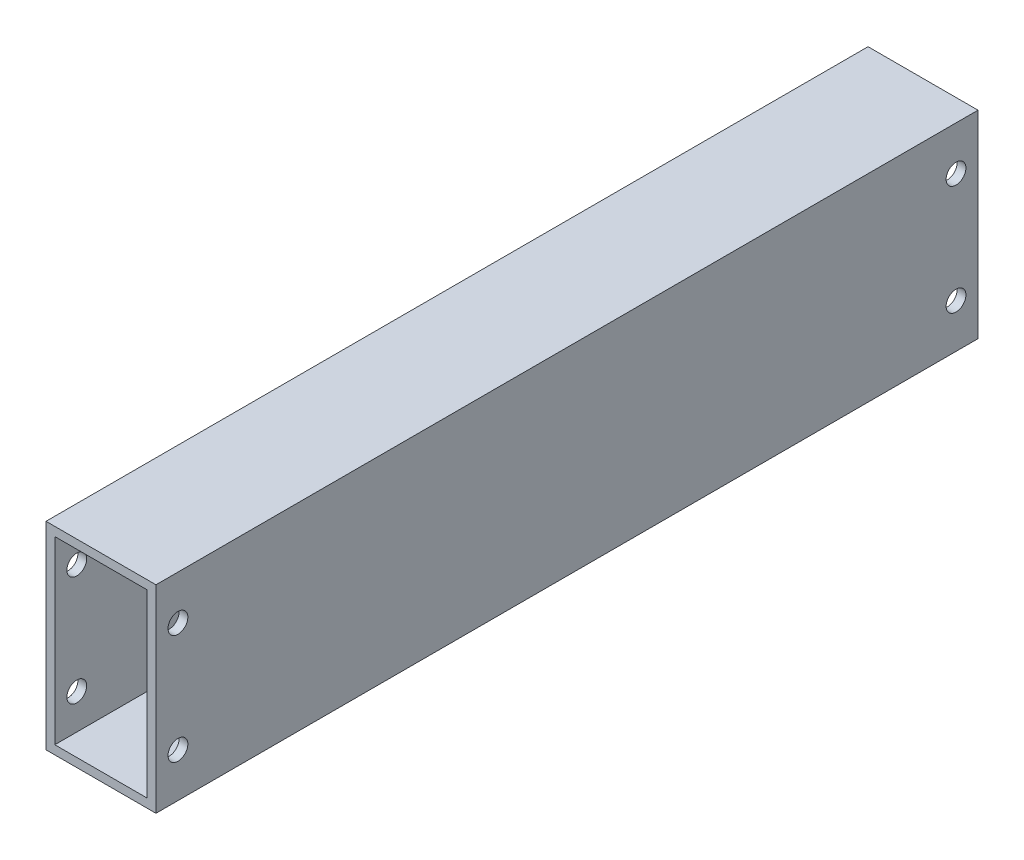
ISO-10303-21;
HEADER;
FILE_DESCRIPTION(('STEP AP214'),'2;1');
FILE_NAME('part.step','',(''),(''),'','','');
FILE_SCHEMA(('AUTOMOTIVE_DESIGN { 1 0 10303 214 1 1 1 1 }'));
ENDSEC;
DATA;
#1=APPLICATION_CONTEXT('core data for automotive mechanical design processes');
#2=APPLICATION_PROTOCOL_DEFINITION('international standard','automotive_design',2000,#1);
#3=PRODUCT_CONTEXT('',#1,'mechanical');
#4=PRODUCT('Part','Part','',(#3));
#5=PRODUCT_RELATED_PRODUCT_CATEGORY('part','',(#4));
#6=PRODUCT_DEFINITION_FORMATION('','',#4);
#7=PRODUCT_DEFINITION_CONTEXT('part definition',#1,'design');
#8=PRODUCT_DEFINITION('design','',#6,#7);
#9=PRODUCT_DEFINITION_SHAPE('','',#8);
#10=(LENGTH_UNIT() NAMED_UNIT(*) SI_UNIT(.MILLI.,.METRE.));
#11=(NAMED_UNIT(*) PLANE_ANGLE_UNIT() SI_UNIT($,.RADIAN.));
#12=(NAMED_UNIT(*) SI_UNIT($,.STERADIAN.) SOLID_ANGLE_UNIT());
#13=UNCERTAINTY_MEASURE_WITH_UNIT(LENGTH_MEASURE(1.E-05),#10,'distance_accuracy_value','');
#14=(GEOMETRIC_REPRESENTATION_CONTEXT(3) GLOBAL_UNCERTAINTY_ASSIGNED_CONTEXT((#13)) GLOBAL_UNIT_ASSIGNED_CONTEXT((#10,
#11,#12)) REPRESENTATION_CONTEXT('',''));
#15=CARTESIAN_POINT('',(0.,0.,0.));
#16=DIRECTION('',(0.,0.,1.));
#17=DIRECTION('',(1.,0.,0.));
#18=AXIS2_PLACEMENT_3D('',#15,#16,#17);
#19=CARTESIAN_POINT('',(0.,0.,226.9));
#20=DIRECTION('',(0.,0.,1.));
#21=DIRECTION('',(1.,0.,0.));
#22=AXIS2_PLACEMENT_3D('',#19,#20,#21);
#23=PLANE('',#22);
#24=DIRECTION('',(0.,-1.,0.));
#25=VECTOR('',#24,1.);
#26=CARTESIAN_POINT('',(-12.5,-22.5,226.9));
#27=LINE('',#26,#25);
#28=CARTESIAN_POINT('',(-12.5,22.5,226.9));
#29=VERTEX_POINT('',#28);
#30=CARTESIAN_POINT('',(-12.5,-22.5,226.9));
#31=VERTEX_POINT('',#30);
#32=EDGE_CURVE('E164',#29,#31,#27,.T.);
#33=ORIENTED_EDGE('',*,*,#32,.T.);
#34=DIRECTION('',(1.,0.,0.));
#35=VECTOR('',#34,1.);
#36=CARTESIAN_POINT('',(12.5,-22.5,226.9));
#37=LINE('',#36,#35);
#38=CARTESIAN_POINT('',(12.5,-22.5,226.9));
#39=VERTEX_POINT('',#38);
#40=EDGE_CURVE('E168',#31,#39,#37,.T.);
#41=ORIENTED_EDGE('',*,*,#40,.T.);
#42=DIRECTION('',(0.,1.,0.));
#43=VECTOR('',#42,1.);
#44=CARTESIAN_POINT('',(12.5,-22.5,226.9));
#45=LINE('',#44,#43);
#46=CARTESIAN_POINT('',(12.5,22.5,226.9));
#47=VERTEX_POINT('',#46);
#48=EDGE_CURVE('E172',#39,#47,#45,.T.);
#49=ORIENTED_EDGE('',*,*,#48,.T.);
#50=DIRECTION('',(-1.,0.,0.));
#51=VECTOR('',#50,1.);
#52=CARTESIAN_POINT('',(12.5,22.5,226.9));
#53=LINE('',#52,#51);
#54=EDGE_CURVE('E175',#47,#29,#53,.T.);
#55=ORIENTED_EDGE('',*,*,#54,.T.);
#56=EDGE_LOOP('',(#33,#41,#49,#55));
#57=FACE_BOUND('',#56,.T.);
#58=DIRECTION('',(0.,1.,0.));
#59=VECTOR('',#58,1.);
#60=CARTESIAN_POINT('',(10.5,-20.5,226.9));
#61=LINE('',#60,#59);
#62=CARTESIAN_POINT('',(10.5,-20.5,226.9));
#63=VERTEX_POINT('',#62);
#64=CARTESIAN_POINT('',(10.5,20.5,226.9));
#65=VERTEX_POINT('',#64);
#66=EDGE_CURVE('E122',#63,#65,#61,.T.);
#67=ORIENTED_EDGE('',*,*,#66,.F.);
#68=DIRECTION('',(1.,0.,0.));
#69=VECTOR('',#68,1.);
#70=CARTESIAN_POINT('',(10.5,-20.5,226.9));
#71=LINE('',#70,#69);
#72=CARTESIAN_POINT('',(-10.5,-20.5,226.9));
#73=VERTEX_POINT('',#72);
#74=EDGE_CURVE('E113',#73,#63,#71,.T.);
#75=ORIENTED_EDGE('',*,*,#74,.F.);
#76=DIRECTION('',(0.,-1.,0.));
#77=VECTOR('',#76,1.);
#78=CARTESIAN_POINT('',(-10.5,-20.5,226.9));
#79=LINE('',#78,#77);
#80=CARTESIAN_POINT('',(-10.5,20.5,226.9));
#81=VERTEX_POINT('',#80);
#82=EDGE_CURVE('E140',#81,#73,#79,.T.);
#83=ORIENTED_EDGE('',*,*,#82,.F.);
#84=DIRECTION('',(-1.,0.,0.));
#85=VECTOR('',#84,1.);
#86=CARTESIAN_POINT('',(10.5,20.5,226.9));
#87=LINE('',#86,#85);
#88=EDGE_CURVE('E135',#65,#81,#87,.T.);
#89=ORIENTED_EDGE('',*,*,#88,.F.);
#90=EDGE_LOOP('',(#67,#75,#83,#89));
#91=FACE_BOUND('',#90,.T.);
#92=ADVANCED_FACE('F45',(#57,#91),#23,.T.);
#93=CARTESIAN_POINT('',(0.,0.,40.));
#94=DIRECTION('',(0.,0.,1.));
#95=DIRECTION('',(1.,0.,0.));
#96=AXIS2_PLACEMENT_3D('',#93,#94,#95);
#97=PLANE('',#96);
#98=DIRECTION('',(0.,-1.,0.));
#99=VECTOR('',#98,1.);
#100=CARTESIAN_POINT('',(-12.5,-22.5,40.));
#101=LINE('',#100,#99);
#102=CARTESIAN_POINT('',(-12.5,22.5,40.));
#103=VERTEX_POINT('',#102);
#104=CARTESIAN_POINT('',(-12.5,-22.5,40.));
#105=VERTEX_POINT('',#104);
#106=EDGE_CURVE('E131',#103,#105,#101,.T.);
#107=ORIENTED_EDGE('',*,*,#106,.F.);
#108=DIRECTION('',(-1.,0.,0.));
#109=VECTOR('',#108,1.);
#110=CARTESIAN_POINT('',(12.5,22.5,40.));
#111=LINE('',#110,#109);
#112=CARTESIAN_POINT('',(12.5,22.5,40.));
#113=VERTEX_POINT('',#112);
#114=EDGE_CURVE('E169',#113,#103,#111,.T.);
#115=ORIENTED_EDGE('',*,*,#114,.F.);
#116=DIRECTION('',(0.,1.,0.));
#117=VECTOR('',#116,1.);
#118=CARTESIAN_POINT('',(12.5,-22.5,40.));
#119=LINE('',#118,#117);
#120=CARTESIAN_POINT('',(12.5,-22.5,40.));
#121=VERTEX_POINT('',#120);
#122=EDGE_CURVE('E185',#121,#113,#119,.T.);
#123=ORIENTED_EDGE('',*,*,#122,.F.);
#124=DIRECTION('',(1.,0.,0.));
#125=VECTOR('',#124,1.);
#126=CARTESIAN_POINT('',(12.5,-22.5,40.));
#127=LINE('',#126,#125);
#128=EDGE_CURVE('E182',#105,#121,#127,.T.);
#129=ORIENTED_EDGE('',*,*,#128,.F.);
#130=EDGE_LOOP('',(#107,#115,#123,#129));
#131=FACE_BOUND('',#130,.T.);
#132=DIRECTION('',(1.,0.,0.));
#133=VECTOR('',#132,1.);
#134=CARTESIAN_POINT('',(10.5,-20.5,40.));
#135=LINE('',#134,#133);
#136=CARTESIAN_POINT('',(-10.5,-20.5,40.));
#137=VERTEX_POINT('',#136);
#138=CARTESIAN_POINT('',(10.5,-20.5,40.));
#139=VERTEX_POINT('',#138);
#140=EDGE_CURVE('E71',#137,#139,#135,.T.);
#141=ORIENTED_EDGE('',*,*,#140,.T.);
#142=DIRECTION('',(0.,1.,0.));
#143=VECTOR('',#142,1.);
#144=CARTESIAN_POINT('',(10.5,-20.5,40.));
#145=LINE('',#144,#143);
#146=CARTESIAN_POINT('',(10.5,20.5,40.));
#147=VERTEX_POINT('',#146);
#148=EDGE_CURVE('E129',#139,#147,#145,.T.);
#149=ORIENTED_EDGE('',*,*,#148,.T.);
#150=DIRECTION('',(-1.,0.,0.));
#151=VECTOR('',#150,1.);
#152=CARTESIAN_POINT('',(10.5,20.5,40.));
#153=LINE('',#152,#151);
#154=CARTESIAN_POINT('',(-10.5,20.5,40.));
#155=VERTEX_POINT('',#154);
#156=EDGE_CURVE('E151',#147,#155,#153,.T.);
#157=ORIENTED_EDGE('',*,*,#156,.T.);
#158=DIRECTION('',(0.,-1.,0.));
#159=VECTOR('',#158,1.);
#160=CARTESIAN_POINT('',(-10.5,-20.5,40.));
#161=LINE('',#160,#159);
#162=EDGE_CURVE('E123',#155,#137,#161,.T.);
#163=ORIENTED_EDGE('',*,*,#162,.T.);
#164=EDGE_LOOP('',(#141,#149,#157,#163));
#165=FACE_BOUND('',#164,.T.);
#166=ADVANCED_FACE('F266',(#131,#165),#97,.F.);
#167=CARTESIAN_POINT('',(-12.5,-22.5,226.9));
#168=DIRECTION('',(1.,0.,0.));
#169=DIRECTION('',(0.,0.,-1.));
#170=AXIS2_PLACEMENT_3D('',#167,#168,#169);
#171=PLANE('',#170);
#172=CARTESIAN_POINT('',(-12.5,-12.5,45.));
#173=DIRECTION('',(1.,0.,0.));
#174=DIRECTION('',(0.,0.,-1.));
#175=AXIS2_PLACEMENT_3D('',#172,#173,#174);
#176=CIRCLE('',#175,2.25);
#177=CARTESIAN_POINT('',(-12.5,-12.5,42.75));
#178=VERTEX_POINT('',#177);
#179=EDGE_CURVE('E316',#178,#178,#176,.T.);
#180=ORIENTED_EDGE('',*,*,#179,.T.);
#181=EDGE_LOOP('',(#180));
#182=FACE_BOUND('',#181,.T.);
#183=CARTESIAN_POINT('',(-12.5,12.5,45.));
#184=DIRECTION('',(1.,0.,0.));
#185=DIRECTION('',(0.,0.,-1.));
#186=AXIS2_PLACEMENT_3D('',#183,#184,#185);
#187=CIRCLE('',#186,2.25);
#188=CARTESIAN_POINT('',(-12.5,12.5,42.75));
#189=VERTEX_POINT('',#188);
#190=EDGE_CURVE('E214',#189,#189,#187,.T.);
#191=ORIENTED_EDGE('',*,*,#190,.T.);
#192=EDGE_LOOP('',(#191));
#193=FACE_BOUND('',#192,.T.);
#194=CARTESIAN_POINT('',(-12.5,12.5,221.9));
#195=DIRECTION('',(1.,0.,0.));
#196=DIRECTION('',(0.,0.,-1.));
#197=AXIS2_PLACEMENT_3D('',#194,#195,#196);
#198=CIRCLE('',#197,2.25);
#199=CARTESIAN_POINT('',(-12.5,12.5,219.65));
#200=VERTEX_POINT('',#199);
#201=EDGE_CURVE('E209',#200,#200,#198,.T.);
#202=ORIENTED_EDGE('',*,*,#201,.T.);
#203=EDGE_LOOP('',(#202));
#204=FACE_BOUND('',#203,.T.);
#205=CARTESIAN_POINT('',(-12.5,-12.5,221.9));
#206=DIRECTION('',(1.,0.,0.));
#207=DIRECTION('',(0.,0.,-1.));
#208=AXIS2_PLACEMENT_3D('',#205,#206,#207);
#209=CIRCLE('',#208,2.25);
#210=CARTESIAN_POINT('',(-12.5,-12.5,219.65));
#211=VERTEX_POINT('',#210);
#212=EDGE_CURVE('E204',#211,#211,#209,.T.);
#213=ORIENTED_EDGE('',*,*,#212,.T.);
#214=EDGE_LOOP('',(#213));
#215=FACE_BOUND('',#214,.T.);
#216=ORIENTED_EDGE('',*,*,#106,.T.);
#217=DIRECTION('',(0.,0.,-1.));
#218=VECTOR('',#217,1.);
#219=CARTESIAN_POINT('',(-12.5,-22.5,226.9));
#220=LINE('',#219,#218);
#221=EDGE_CURVE('E11',#31,#105,#220,.T.);
#222=ORIENTED_EDGE('',*,*,#221,.F.);
#223=ORIENTED_EDGE('',*,*,#32,.F.);
#224=DIRECTION('',(0.,0.,-1.));
#225=VECTOR('',#224,1.);
#226=CARTESIAN_POINT('',(-12.5,22.5,226.9));
#227=LINE('',#226,#225);
#228=EDGE_CURVE('E178',#29,#103,#227,.T.);
#229=ORIENTED_EDGE('',*,*,#228,.T.);
#230=EDGE_LOOP('',(#216,#222,#223,#229));
#231=FACE_BOUND('',#230,.T.);
#232=ADVANCED_FACE('F47',(#182,#193,#204,#215,#231),#171,.F.);
#233=CARTESIAN_POINT('',(12.5,-22.5,226.9));
#234=DIRECTION('',(0.,1.,0.));
#235=DIRECTION('',(0.,0.,1.));
#236=AXIS2_PLACEMENT_3D('',#233,#234,#235);
#237=PLANE('',#236);
#238=ORIENTED_EDGE('',*,*,#128,.T.);
#239=DIRECTION('',(0.,0.,-1.));
#240=VECTOR('',#239,1.);
#241=CARTESIAN_POINT('',(12.5,-22.5,226.9));
#242=LINE('',#241,#240);
#243=EDGE_CURVE('E55',#39,#121,#242,.T.);
#244=ORIENTED_EDGE('',*,*,#243,.F.);
#245=ORIENTED_EDGE('',*,*,#40,.F.);
#246=ORIENTED_EDGE('',*,*,#221,.T.);
#247=EDGE_LOOP('',(#238,#244,#245,#246));
#248=FACE_BOUND('',#247,.T.);
#249=ADVANCED_FACE('F293',(#248),#237,.F.);
#250=CARTESIAN_POINT('',(12.5,-22.5,226.9));
#251=DIRECTION('',(-1.,0.,0.));
#252=DIRECTION('',(0.,0.,1.));
#253=AXIS2_PLACEMENT_3D('',#250,#251,#252);
#254=PLANE('',#253);
#255=CARTESIAN_POINT('',(12.5,-12.5,45.));
#256=DIRECTION('',(1.,0.,0.));
#257=DIRECTION('',(0.,0.,-1.));
#258=AXIS2_PLACEMENT_3D('',#255,#256,#257);
#259=CIRCLE('',#258,2.25);
#260=CARTESIAN_POINT('',(12.5,-12.5,42.75));
#261=VERTEX_POINT('',#260);
#262=EDGE_CURVE('E352',#261,#261,#259,.T.);
#263=ORIENTED_EDGE('',*,*,#262,.F.);
#264=EDGE_LOOP('',(#263));
#265=FACE_BOUND('',#264,.T.);
#266=CARTESIAN_POINT('',(12.5,12.5,45.));
#267=DIRECTION('',(1.,0.,0.));
#268=DIRECTION('',(0.,0.,-1.));
#269=AXIS2_PLACEMENT_3D('',#266,#267,#268);
#270=CIRCLE('',#269,2.25);
#271=CARTESIAN_POINT('',(12.5,12.5,42.75));
#272=VERTEX_POINT('',#271);
#273=EDGE_CURVE('E224',#272,#272,#270,.T.);
#274=ORIENTED_EDGE('',*,*,#273,.F.);
#275=EDGE_LOOP('',(#274));
#276=FACE_BOUND('',#275,.T.);
#277=CARTESIAN_POINT('',(12.5,12.5,221.9));
#278=DIRECTION('',(1.,0.,0.));
#279=DIRECTION('',(0.,0.,-1.));
#280=AXIS2_PLACEMENT_3D('',#277,#278,#279);
#281=CIRCLE('',#280,2.25);
#282=CARTESIAN_POINT('',(12.5,12.5,219.65));
#283=VERTEX_POINT('',#282);
#284=EDGE_CURVE('E221',#283,#283,#281,.T.);
#285=ORIENTED_EDGE('',*,*,#284,.F.);
#286=EDGE_LOOP('',(#285));
#287=FACE_BOUND('',#286,.T.);
#288=CARTESIAN_POINT('',(12.5,-12.5,221.9));
#289=DIRECTION('',(1.,0.,0.));
#290=DIRECTION('',(0.,0.,-1.));
#291=AXIS2_PLACEMENT_3D('',#288,#289,#290);
#292=CIRCLE('',#291,2.25);
#293=CARTESIAN_POINT('',(12.5,-12.5,219.65));
#294=VERTEX_POINT('',#293);
#295=EDGE_CURVE('E244',#294,#294,#292,.T.);
#296=ORIENTED_EDGE('',*,*,#295,.F.);
#297=EDGE_LOOP('',(#296));
#298=FACE_BOUND('',#297,.T.);
#299=ORIENTED_EDGE('',*,*,#122,.T.);
#300=DIRECTION('',(0.,0.,-1.));
#301=VECTOR('',#300,1.);
#302=CARTESIAN_POINT('',(12.5,22.5,226.9));
#303=LINE('',#302,#301);
#304=EDGE_CURVE('E193',#47,#113,#303,.T.);
#305=ORIENTED_EDGE('',*,*,#304,.F.);
#306=ORIENTED_EDGE('',*,*,#48,.F.);
#307=ORIENTED_EDGE('',*,*,#243,.T.);
#308=EDGE_LOOP('',(#299,#305,#306,#307));
#309=FACE_BOUND('',#308,.T.);
#310=ADVANCED_FACE('F290',(#265,#276,#287,#298,#309),#254,.F.);
#311=CARTESIAN_POINT('',(12.5,22.5,226.9));
#312=DIRECTION('',(0.,-1.,0.));
#313=DIRECTION('',(0.,0.,-1.));
#314=AXIS2_PLACEMENT_3D('',#311,#312,#313);
#315=PLANE('',#314);
#316=ORIENTED_EDGE('',*,*,#114,.T.);
#317=ORIENTED_EDGE('',*,*,#228,.F.);
#318=ORIENTED_EDGE('',*,*,#54,.F.);
#319=ORIENTED_EDGE('',*,*,#304,.T.);
#320=EDGE_LOOP('',(#316,#317,#318,#319));
#321=FACE_BOUND('',#320,.T.);
#322=ADVANCED_FACE('F287',(#321),#315,.F.);
#323=CARTESIAN_POINT('',(10.5,-20.5,226.9));
#324=DIRECTION('',(0.,1.,0.));
#325=DIRECTION('',(0.,0.,1.));
#326=AXIS2_PLACEMENT_3D('',#323,#324,#325);
#327=PLANE('',#326);
#328=ORIENTED_EDGE('',*,*,#140,.F.);
#329=DIRECTION('',(0.,0.,-1.));
#330=VECTOR('',#329,1.);
#331=CARTESIAN_POINT('',(-10.5,-20.5,226.9));
#332=LINE('',#331,#330);
#333=EDGE_CURVE('E117',#73,#137,#332,.T.);
#334=ORIENTED_EDGE('',*,*,#333,.F.);
#335=ORIENTED_EDGE('',*,*,#74,.T.);
#336=DIRECTION('',(0.,0.,-1.));
#337=VECTOR('',#336,1.);
#338=CARTESIAN_POINT('',(10.5,-20.5,226.9));
#339=LINE('',#338,#337);
#340=EDGE_CURVE('E116',#63,#139,#339,.T.);
#341=ORIENTED_EDGE('',*,*,#340,.T.);
#342=EDGE_LOOP('',(#328,#334,#335,#341));
#343=FACE_BOUND('',#342,.T.);
#344=ADVANCED_FACE('F115',(#343),#327,.T.);
#345=CARTESIAN_POINT('',(10.5,-20.5,226.9));
#346=DIRECTION('',(-1.,0.,0.));
#347=DIRECTION('',(0.,0.,1.));
#348=AXIS2_PLACEMENT_3D('',#345,#346,#347);
#349=PLANE('',#348);
#350=CARTESIAN_POINT('',(10.5,-12.5,45.));
#351=DIRECTION('',(-1.,0.,0.));
#352=DIRECTION('',(0.,0.,1.));
#353=AXIS2_PLACEMENT_3D('',#350,#351,#352);
#354=CIRCLE('',#353,2.25);
#355=CARTESIAN_POINT('',(10.5,-12.5,47.25));
#356=VERTEX_POINT('',#355);
#357=EDGE_CURVE('E49',#356,#356,#354,.T.);
#358=ORIENTED_EDGE('',*,*,#357,.F.);
#359=EDGE_LOOP('',(#358));
#360=FACE_BOUND('',#359,.T.);
#361=CARTESIAN_POINT('',(10.5,12.5,45.));
#362=DIRECTION('',(-1.,0.,0.));
#363=DIRECTION('',(0.,0.,1.));
#364=AXIS2_PLACEMENT_3D('',#361,#362,#363);
#365=CIRCLE('',#364,2.25);
#366=CARTESIAN_POINT('',(10.5,12.5,47.25));
#367=VERTEX_POINT('',#366);
#368=EDGE_CURVE('E210',#367,#367,#365,.T.);
#369=ORIENTED_EDGE('',*,*,#368,.F.);
#370=EDGE_LOOP('',(#369));
#371=FACE_BOUND('',#370,.T.);
#372=CARTESIAN_POINT('',(10.5,12.5,221.9));
#373=DIRECTION('',(-1.,0.,0.));
#374=DIRECTION('',(0.,0.,1.));
#375=AXIS2_PLACEMENT_3D('',#372,#373,#374);
#376=CIRCLE('',#375,2.25);
#377=CARTESIAN_POINT('',(10.5,12.5,224.15));
#378=VERTEX_POINT('',#377);
#379=EDGE_CURVE('E208',#378,#378,#376,.T.);
#380=ORIENTED_EDGE('',*,*,#379,.F.);
#381=EDGE_LOOP('',(#380));
#382=FACE_BOUND('',#381,.T.);
#383=CARTESIAN_POINT('',(10.5,-12.5,221.9));
#384=DIRECTION('',(-1.,0.,0.));
#385=DIRECTION('',(0.,0.,1.));
#386=AXIS2_PLACEMENT_3D('',#383,#384,#385);
#387=CIRCLE('',#386,2.25);
#388=CARTESIAN_POINT('',(10.5,-12.5,224.15));
#389=VERTEX_POINT('',#388);
#390=EDGE_CURVE('E200',#389,#389,#387,.T.);
#391=ORIENTED_EDGE('',*,*,#390,.F.);
#392=EDGE_LOOP('',(#391));
#393=FACE_BOUND('',#392,.T.);
#394=ORIENTED_EDGE('',*,*,#148,.F.);
#395=ORIENTED_EDGE('',*,*,#340,.F.);
#396=ORIENTED_EDGE('',*,*,#66,.T.);
#397=DIRECTION('',(0.,0.,-1.));
#398=VECTOR('',#397,1.);
#399=CARTESIAN_POINT('',(10.5,20.5,226.9));
#400=LINE('',#399,#398);
#401=EDGE_CURVE('E132',#65,#147,#400,.T.);
#402=ORIENTED_EDGE('',*,*,#401,.T.);
#403=EDGE_LOOP('',(#394,#395,#396,#402));
#404=FACE_BOUND('',#403,.T.);
#405=ADVANCED_FACE('F126',(#360,#371,#382,#393,#404),#349,.T.);
#406=CARTESIAN_POINT('',(10.5,20.5,226.9));
#407=DIRECTION('',(0.,-1.,0.));
#408=DIRECTION('',(0.,0.,-1.));
#409=AXIS2_PLACEMENT_3D('',#406,#407,#408);
#410=PLANE('',#409);
#411=ORIENTED_EDGE('',*,*,#156,.F.);
#412=ORIENTED_EDGE('',*,*,#401,.F.);
#413=ORIENTED_EDGE('',*,*,#88,.T.);
#414=DIRECTION('',(0.,0.,-1.));
#415=VECTOR('',#414,1.);
#416=CARTESIAN_POINT('',(-10.5,20.5,226.9));
#417=LINE('',#416,#415);
#418=EDGE_CURVE('E63',#81,#155,#417,.T.);
#419=ORIENTED_EDGE('',*,*,#418,.T.);
#420=EDGE_LOOP('',(#411,#412,#413,#419));
#421=FACE_BOUND('',#420,.T.);
#422=ADVANCED_FACE('F261',(#421),#410,.T.);
#423=CARTESIAN_POINT('',(-10.5,-20.5,226.9));
#424=DIRECTION('',(1.,0.,0.));
#425=DIRECTION('',(0.,1.,0.));
#426=AXIS2_PLACEMENT_3D('',#423,#424,#425);
#427=PLANE('',#426);
#428=CARTESIAN_POINT('',(-10.5,-12.5,45.));
#429=DIRECTION('',(1.,0.,0.));
#430=DIRECTION('',(0.,1.,0.));
#431=AXIS2_PLACEMENT_3D('',#428,#429,#430);
#432=CIRCLE('',#431,2.25);
#433=CARTESIAN_POINT('',(-10.5,-10.25,45.));
#434=VERTEX_POINT('',#433);
#435=EDGE_CURVE('E231',#434,#434,#432,.T.);
#436=ORIENTED_EDGE('',*,*,#435,.F.);
#437=EDGE_LOOP('',(#436));
#438=FACE_BOUND('',#437,.T.);
#439=CARTESIAN_POINT('',(-10.5,12.5,45.));
#440=DIRECTION('',(1.,0.,0.));
#441=DIRECTION('',(0.,1.,0.));
#442=AXIS2_PLACEMENT_3D('',#439,#440,#441);
#443=CIRCLE('',#442,2.25);
#444=CARTESIAN_POINT('',(-10.5,14.75,45.));
#445=VERTEX_POINT('',#444);
#446=EDGE_CURVE('E213',#445,#445,#443,.T.);
#447=ORIENTED_EDGE('',*,*,#446,.F.);
#448=EDGE_LOOP('',(#447));
#449=FACE_BOUND('',#448,.T.);
#450=CARTESIAN_POINT('',(-10.5,12.5,221.9));
#451=DIRECTION('',(1.,0.,0.));
#452=DIRECTION('',(0.,1.,0.));
#453=AXIS2_PLACEMENT_3D('',#450,#451,#452);
#454=CIRCLE('',#453,2.25);
#455=CARTESIAN_POINT('',(-10.5,14.75,221.9));
#456=VERTEX_POINT('',#455);
#457=EDGE_CURVE('E205',#456,#456,#454,.T.);
#458=ORIENTED_EDGE('',*,*,#457,.F.);
#459=EDGE_LOOP('',(#458));
#460=FACE_BOUND('',#459,.T.);
#461=CARTESIAN_POINT('',(-10.5,-12.5,221.9));
#462=DIRECTION('',(1.,0.,0.));
#463=DIRECTION('',(0.,1.,0.));
#464=AXIS2_PLACEMENT_3D('',#461,#462,#463);
#465=CIRCLE('',#464,2.25);
#466=CARTESIAN_POINT('',(-10.5,-10.25,221.9));
#467=VERTEX_POINT('',#466);
#468=EDGE_CURVE('E148',#467,#467,#465,.T.);
#469=ORIENTED_EDGE('',*,*,#468,.F.);
#470=EDGE_LOOP('',(#469));
#471=FACE_BOUND('',#470,.T.);
#472=ORIENTED_EDGE('',*,*,#162,.F.);
#473=ORIENTED_EDGE('',*,*,#418,.F.);
#474=ORIENTED_EDGE('',*,*,#82,.T.);
#475=ORIENTED_EDGE('',*,*,#333,.T.);
#476=EDGE_LOOP('',(#472,#473,#474,#475));
#477=FACE_BOUND('',#476,.T.);
#478=ADVANCED_FACE('F258',(#438,#449,#460,#471,#477),#427,.T.);
#479=CARTESIAN_POINT('',(12.5,-12.5,221.9));
#480=DIRECTION('',(1.,0.,0.));
#481=DIRECTION('',(0.,0.,-1.));
#482=AXIS2_PLACEMENT_3D('',#479,#480,#481);
#483=CYLINDRICAL_SURFACE('',#482,2.25);
#484=ORIENTED_EDGE('',*,*,#390,.T.);
#485=EDGE_LOOP('',(#484));
#486=FACE_BOUND('',#485,.T.);
#487=ORIENTED_EDGE('',*,*,#295,.T.);
#488=EDGE_LOOP('',(#487));
#489=FACE_BOUND('',#488,.T.);
#490=ADVANCED_FACE('F260',(#486,#489),#483,.F.);
#491=ORIENTED_EDGE('',*,*,#468,.T.);
#492=EDGE_LOOP('',(#491));
#493=FACE_BOUND('',#492,.T.);
#494=ORIENTED_EDGE('',*,*,#212,.F.);
#495=EDGE_LOOP('',(#494));
#496=FACE_BOUND('',#495,.T.);
#497=ADVANCED_FACE('F255',(#493,#496),#483,.F.);
#498=CARTESIAN_POINT('',(12.5,12.5,221.9));
#499=DIRECTION('',(1.,0.,0.));
#500=DIRECTION('',(0.,0.,-1.));
#501=AXIS2_PLACEMENT_3D('',#498,#499,#500);
#502=CYLINDRICAL_SURFACE('',#501,2.25);
#503=ORIENTED_EDGE('',*,*,#457,.T.);
#504=EDGE_LOOP('',(#503));
#505=FACE_BOUND('',#504,.T.);
#506=ORIENTED_EDGE('',*,*,#201,.F.);
#507=EDGE_LOOP('',(#506));
#508=FACE_BOUND('',#507,.T.);
#509=ADVANCED_FACE('F322',(#505,#508),#502,.F.);
#510=ORIENTED_EDGE('',*,*,#379,.T.);
#511=EDGE_LOOP('',(#510));
#512=FACE_BOUND('',#511,.T.);
#513=ORIENTED_EDGE('',*,*,#284,.T.);
#514=EDGE_LOOP('',(#513));
#515=FACE_BOUND('',#514,.T.);
#516=ADVANCED_FACE('F328',(#512,#515),#502,.F.);
#517=CARTESIAN_POINT('',(12.5,12.5,45.));
#518=DIRECTION('',(1.,0.,0.));
#519=DIRECTION('',(0.,0.,-1.));
#520=AXIS2_PLACEMENT_3D('',#517,#518,#519);
#521=CYLINDRICAL_SURFACE('',#520,2.25);
#522=ORIENTED_EDGE('',*,*,#368,.T.);
#523=EDGE_LOOP('',(#522));
#524=FACE_BOUND('',#523,.T.);
#525=ORIENTED_EDGE('',*,*,#273,.T.);
#526=EDGE_LOOP('',(#525));
#527=FACE_BOUND('',#526,.T.);
#528=ADVANCED_FACE('F333',(#524,#527),#521,.F.);
#529=ORIENTED_EDGE('',*,*,#446,.T.);
#530=EDGE_LOOP('',(#529));
#531=FACE_BOUND('',#530,.T.);
#532=ORIENTED_EDGE('',*,*,#190,.F.);
#533=EDGE_LOOP('',(#532));
#534=FACE_BOUND('',#533,.T.);
#535=ADVANCED_FACE('F336',(#531,#534),#521,.F.);
#536=CARTESIAN_POINT('',(12.5,-12.5,45.));
#537=DIRECTION('',(1.,0.,0.));
#538=DIRECTION('',(0.,0.,-1.));
#539=AXIS2_PLACEMENT_3D('',#536,#537,#538);
#540=CYLINDRICAL_SURFACE('',#539,2.25);
#541=ORIENTED_EDGE('',*,*,#357,.T.);
#542=EDGE_LOOP('',(#541));
#543=FACE_BOUND('',#542,.T.);
#544=ORIENTED_EDGE('',*,*,#262,.T.);
#545=EDGE_LOOP('',(#544));
#546=FACE_BOUND('',#545,.T.);
#547=ADVANCED_FACE('F337',(#543,#546),#540,.F.);
#548=ORIENTED_EDGE('',*,*,#435,.T.);
#549=EDGE_LOOP('',(#548));
#550=FACE_BOUND('',#549,.T.);
#551=ORIENTED_EDGE('',*,*,#179,.F.);
#552=EDGE_LOOP('',(#551));
#553=FACE_BOUND('',#552,.T.);
#554=ADVANCED_FACE('F339',(#550,#553),#540,.F.);
#555=CLOSED_SHELL('',(#92,#166,#232,#249,#310,#322,#344,#405,#422,#478,#490,#497,#509,#516,#528,
#535,#547,#554));
#556=MANIFOLD_SOLID_BREP('B2',#555);
#557=ADVANCED_BREP_SHAPE_REPRESENTATION('',(#18,#556),#14);
#558=SHAPE_DEFINITION_REPRESENTATION(#9,#557);
ENDSEC;
END-ISO-10303-21;
